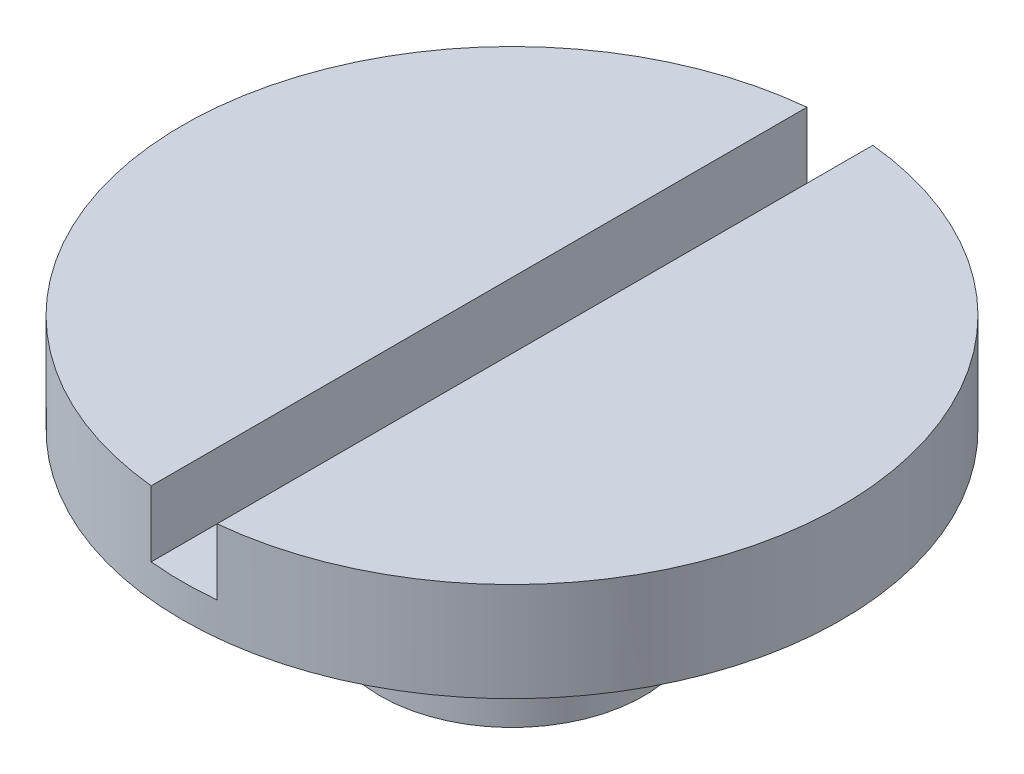
ISO-10303-21;
HEADER;
FILE_DESCRIPTION(('STEP AP214'),'2;1');
FILE_NAME('part.step','',(''),(''),'','','');
FILE_SCHEMA(('AUTOMOTIVE_DESIGN { 1 0 10303 214 1 1 1 1 }'));
ENDSEC;
DATA;
#1=APPLICATION_CONTEXT('core data for automotive mechanical design processes');
#2=APPLICATION_PROTOCOL_DEFINITION('international standard','automotive_design',2000,#1);
#3=PRODUCT_CONTEXT('',#1,'mechanical');
#4=PRODUCT('Part','Part','',(#3));
#5=PRODUCT_RELATED_PRODUCT_CATEGORY('part','',(#4));
#6=PRODUCT_DEFINITION_FORMATION('','',#4);
#7=PRODUCT_DEFINITION_CONTEXT('part definition',#1,'design');
#8=PRODUCT_DEFINITION('design','',#6,#7);
#9=PRODUCT_DEFINITION_SHAPE('','',#8);
#10=(LENGTH_UNIT() NAMED_UNIT(*) SI_UNIT(.MILLI.,.METRE.));
#11=(NAMED_UNIT(*) PLANE_ANGLE_UNIT() SI_UNIT($,.RADIAN.));
#12=(NAMED_UNIT(*) SI_UNIT($,.STERADIAN.) SOLID_ANGLE_UNIT());
#13=UNCERTAINTY_MEASURE_WITH_UNIT(LENGTH_MEASURE(1.E-05),#10,'distance_accuracy_value','');
#14=(GEOMETRIC_REPRESENTATION_CONTEXT(3) GLOBAL_UNCERTAINTY_ASSIGNED_CONTEXT((#13)) GLOBAL_UNIT_ASSIGNED_CONTEXT((#10,
#11,#12)) REPRESENTATION_CONTEXT('',''));
#15=CARTESIAN_POINT('',(0.,0.,0.));
#16=DIRECTION('',(0.,0.,1.));
#17=DIRECTION('',(1.,0.,0.));
#18=AXIS2_PLACEMENT_3D('',#15,#16,#17);
#19=CARTESIAN_POINT('',(0.,0.,0.));
#20=DIRECTION('',(0.,1.,0.));
#21=DIRECTION('',(0.,0.,1.));
#22=AXIS2_PLACEMENT_3D('',#19,#20,#21);
#23=PLANE('',#22);
#24=CARTESIAN_POINT('',(0.,0.,0.));
#25=DIRECTION('',(0.,1.,0.));
#26=DIRECTION('',(0.,0.,1.));
#27=AXIS2_PLACEMENT_3D('',#24,#25,#26);
#28=CIRCLE('',#27,50.);
#29=CARTESIAN_POINT('',(0.,0.,50.));
#30=VERTEX_POINT('',#29);
#31=EDGE_CURVE('E160',#30,#30,#28,.T.);
#32=ORIENTED_EDGE('',*,*,#31,.F.);
#33=EDGE_LOOP('',(#32));
#34=FACE_BOUND('',#33,.T.);
#35=CARTESIAN_POINT('',(0.,0.,0.));
#36=DIRECTION('',(0.,1.,0.));
#37=DIRECTION('',(0.,0.,1.));
#38=AXIS2_PLACEMENT_3D('',#35,#36,#37);
#39=CIRCLE('',#38,20.);
#40=CARTESIAN_POINT('',(0.,0.,20.));
#41=VERTEX_POINT('',#40);
#42=EDGE_CURVE('E11',#41,#41,#39,.F.);
#43=ORIENTED_EDGE('',*,*,#42,.F.);
#44=EDGE_LOOP('',(#43));
#45=FACE_BOUND('',#44,.T.);
#46=ADVANCED_FACE('F34',(#34,#45),#23,.F.);
#47=CARTESIAN_POINT('',(0.,15.,0.));
#48=DIRECTION('',(0.,1.,0.));
#49=DIRECTION('',(0.,0.,1.));
#50=AXIS2_PLACEMENT_3D('',#47,#48,#49);
#51=PLANE('',#50);
#52=DIRECTION('',(0.,0.,-1.));
#53=VECTOR('',#52,1.);
#54=CARTESIAN_POINT('',(4.99999999999999,15.,-49.749371855331));
#55=LINE('',#54,#53);
#56=CARTESIAN_POINT('',(5.,15.,49.749371855331));
#57=VERTEX_POINT('',#56);
#58=CARTESIAN_POINT('',(4.99999999999999,15.,-49.749371855331));
#59=VERTEX_POINT('',#58);
#60=EDGE_CURVE('E147',#57,#59,#55,.T.);
#61=ORIENTED_EDGE('',*,*,#60,.F.);
#62=CARTESIAN_POINT('',(0.,15.,0.));
#63=DIRECTION('',(0.,1.,0.));
#64=DIRECTION('',(0.,0.,1.));
#65=AXIS2_PLACEMENT_3D('',#62,#63,#64);
#66=CIRCLE('',#65,50.);
#67=EDGE_CURVE('E42',#57,#59,#66,.T.);
#68=ORIENTED_EDGE('',*,*,#67,.T.);
#69=EDGE_LOOP('',(#61,#68));
#70=FACE_BOUND('',#69,.T.);
#71=ADVANCED_FACE('F188',(#70),#51,.T.);
#72=CARTESIAN_POINT('',(0.,15.,0.));
#73=DIRECTION('',(0.,-1.,0.));
#74=DIRECTION('',(0.,0.,-1.));
#75=AXIS2_PLACEMENT_3D('',#72,#73,#74);
#76=CYLINDRICAL_SURFACE('',#75,50.);
#77=CARTESIAN_POINT('',(0.,5.,0.));
#78=DIRECTION('',(0.,1.,0.));
#79=DIRECTION('',(0.,0.,1.));
#80=AXIS2_PLACEMENT_3D('',#77,#78,#79);
#81=CIRCLE('',#80,50.);
#82=CARTESIAN_POINT('',(4.99999999999999,5.,-49.749371855331));
#83=VERTEX_POINT('',#82);
#84=CARTESIAN_POINT('',(-4.99999999999999,5.,-49.749371855331));
#85=VERTEX_POINT('',#84);
#86=EDGE_CURVE('E143',#83,#85,#81,.T.);
#87=ORIENTED_EDGE('',*,*,#86,.F.);
#88=DIRECTION('',(0.,1.,0.));
#89=VECTOR('',#88,1.);
#90=CARTESIAN_POINT('',(4.99999999999999,5.,-49.749371855331));
#91=LINE('',#90,#89);
#92=EDGE_CURVE('E157',#83,#59,#91,.T.);
#93=ORIENTED_EDGE('',*,*,#92,.T.);
#94=ORIENTED_EDGE('',*,*,#67,.F.);
#95=DIRECTION('',(0.,1.,0.));
#96=VECTOR('',#95,1.);
#97=CARTESIAN_POINT('',(5.,5.,49.749371855331));
#98=LINE('',#97,#96);
#99=CARTESIAN_POINT('',(5.,5.,49.749371855331));
#100=VERTEX_POINT('',#99);
#101=EDGE_CURVE('E161',#100,#57,#98,.T.);
#102=ORIENTED_EDGE('',*,*,#101,.F.);
#103=CARTESIAN_POINT('',(0.,5.,0.));
#104=DIRECTION('',(0.,1.,0.));
#105=DIRECTION('',(0.,0.,1.));
#106=AXIS2_PLACEMENT_3D('',#103,#104,#105);
#107=CIRCLE('',#106,50.);
#108=CARTESIAN_POINT('',(-4.99999999999999,5.,49.749371855331));
#109=VERTEX_POINT('',#108);
#110=EDGE_CURVE('E150',#109,#100,#107,.T.);
#111=ORIENTED_EDGE('',*,*,#110,.F.);
#112=DIRECTION('',(0.,1.,0.));
#113=VECTOR('',#112,1.);
#114=CARTESIAN_POINT('',(-4.99999999999999,5.,49.749371855331));
#115=LINE('',#114,#113);
#116=CARTESIAN_POINT('',(-4.99999999999999,15.,49.749371855331));
#117=VERTEX_POINT('',#116);
#118=EDGE_CURVE('E163',#109,#117,#115,.T.);
#119=ORIENTED_EDGE('',*,*,#118,.T.);
#120=CARTESIAN_POINT('',(-4.99999999999999,15.,-49.749371855331));
#121=VERTEX_POINT('',#120);
#122=EDGE_CURVE('E168',#121,#117,#66,.T.);
#123=ORIENTED_EDGE('',*,*,#122,.F.);
#124=DIRECTION('',(0.,1.,0.));
#125=VECTOR('',#124,1.);
#126=CARTESIAN_POINT('',(-4.99999999999999,5.,-49.749371855331));
#127=LINE('',#126,#125);
#128=EDGE_CURVE('E57',#85,#121,#127,.T.);
#129=ORIENTED_EDGE('',*,*,#128,.F.);
#130=EDGE_LOOP('',(#87,#93,#94,#102,#111,#119,#123,#129));
#131=FACE_BOUND('',#130,.T.);
#132=ORIENTED_EDGE('',*,*,#31,.T.);
#133=EDGE_LOOP('',(#132));
#134=FACE_BOUND('',#133,.T.);
#135=ADVANCED_FACE('F36',(#131,#134),#76,.T.);
#136=DIRECTION('',(0.,0.,1.));
#137=VECTOR('',#136,1.);
#138=CARTESIAN_POINT('',(-4.99999999999999,15.,-49.749371855331));
#139=LINE('',#138,#137);
#140=EDGE_CURVE('E110',#121,#117,#139,.T.);
#141=ORIENTED_EDGE('',*,*,#140,.F.);
#142=ORIENTED_EDGE('',*,*,#122,.T.);
#143=EDGE_LOOP('',(#141,#142));
#144=FACE_BOUND('',#143,.T.);
#145=ADVANCED_FACE('F175',(#144),#51,.T.);
#146=CARTESIAN_POINT('',(4.99999999999999,5.,-49.749371855331));
#147=DIRECTION('',(1.,0.,0.));
#148=DIRECTION('',(0.,0.,-1.));
#149=AXIS2_PLACEMENT_3D('',#146,#147,#148);
#150=PLANE('',#149);
#151=ORIENTED_EDGE('',*,*,#60,.T.);
#152=ORIENTED_EDGE('',*,*,#92,.F.);
#153=DIRECTION('',(0.,0.,-1.));
#154=VECTOR('',#153,1.);
#155=CARTESIAN_POINT('',(4.99999999999999,5.,-49.749371855331));
#156=LINE('',#155,#154);
#157=EDGE_CURVE('E152',#100,#83,#156,.T.);
#158=ORIENTED_EDGE('',*,*,#157,.F.);
#159=ORIENTED_EDGE('',*,*,#101,.T.);
#160=EDGE_LOOP('',(#151,#152,#158,#159));
#161=FACE_BOUND('',#160,.T.);
#162=ADVANCED_FACE('F189',(#161),#150,.F.);
#163=CARTESIAN_POINT('',(-4.99999999999999,5.,-49.749371855331));
#164=DIRECTION('',(-1.,0.,0.));
#165=DIRECTION('',(0.,0.,1.));
#166=AXIS2_PLACEMENT_3D('',#163,#164,#165);
#167=PLANE('',#166);
#168=ORIENTED_EDGE('',*,*,#140,.T.);
#169=ORIENTED_EDGE('',*,*,#118,.F.);
#170=DIRECTION('',(0.,0.,1.));
#171=VECTOR('',#170,1.);
#172=CARTESIAN_POINT('',(-4.99999999999999,5.,-49.749371855331));
#173=LINE('',#172,#171);
#174=EDGE_CURVE('E146',#85,#109,#173,.T.);
#175=ORIENTED_EDGE('',*,*,#174,.F.);
#176=ORIENTED_EDGE('',*,*,#128,.T.);
#177=EDGE_LOOP('',(#168,#169,#175,#176));
#178=FACE_BOUND('',#177,.T.);
#179=ADVANCED_FACE('F180',(#178),#167,.F.);
#180=CARTESIAN_POINT('',(0.,5.,0.));
#181=DIRECTION('',(0.,1.,0.));
#182=DIRECTION('',(0.,0.,1.));
#183=AXIS2_PLACEMENT_3D('',#180,#181,#182);
#184=PLANE('',#183);
#185=ORIENTED_EDGE('',*,*,#86,.T.);
#186=ORIENTED_EDGE('',*,*,#174,.T.);
#187=ORIENTED_EDGE('',*,*,#110,.T.);
#188=ORIENTED_EDGE('',*,*,#157,.T.);
#189=EDGE_LOOP('',(#185,#186,#187,#188));
#190=FACE_BOUND('',#189,.T.);
#191=ADVANCED_FACE('F182',(#190),#184,.T.);
#192=CARTESIAN_POINT('',(0.,-25.,0.));
#193=DIRECTION('',(0.,1.,0.));
#194=DIRECTION('',(0.,0.,1.));
#195=AXIS2_PLACEMENT_3D('',#192,#193,#194);
#196=CYLINDRICAL_SURFACE('',#195,15.);
#197=CARTESIAN_POINT('',(0.,0.,0.));
#198=DIRECTION('',(0.,-1.,0.));
#199=DIRECTION('',(0.,0.,-1.));
#200=AXIS2_PLACEMENT_3D('',#197,#198,#199);
#201=CIRCLE('',#200,15.);
#202=CARTESIAN_POINT('',(-3.,0.,14.6969384566991));
#203=VERTEX_POINT('',#202);
#204=CARTESIAN_POINT('',(3.,0.,14.6969384566991));
#205=VERTEX_POINT('',#204);
#206=EDGE_CURVE('E106',#203,#205,#201,.T.);
#207=ORIENTED_EDGE('',*,*,#206,.F.);
#208=DIRECTION('',(0.,1.,0.));
#209=VECTOR('',#208,1.);
#210=CARTESIAN_POINT('',(-3.,-25.,14.6969384566991));
#211=LINE('',#210,#209);
#212=CARTESIAN_POINT('',(-3.,-25.,14.6969384566991));
#213=VERTEX_POINT('',#212);
#214=EDGE_CURVE('E99',#213,#203,#211,.T.);
#215=ORIENTED_EDGE('',*,*,#214,.F.);
#216=CARTESIAN_POINT('',(0.,-25.,0.));
#217=DIRECTION('',(0.,-1.,0.));
#218=DIRECTION('',(0.,0.,-1.));
#219=AXIS2_PLACEMENT_3D('',#216,#217,#218);
#220=CIRCLE('',#219,15.);
#221=CARTESIAN_POINT('',(3.,-25.,14.6969384566991));
#222=VERTEX_POINT('',#221);
#223=EDGE_CURVE('E103',#213,#222,#220,.T.);
#224=ORIENTED_EDGE('',*,*,#223,.T.);
#225=DIRECTION('',(0.,1.,0.));
#226=VECTOR('',#225,1.);
#227=CARTESIAN_POINT('',(3.,-25.,14.6969384566991));
#228=LINE('',#227,#226);
#229=EDGE_CURVE('E132',#222,#205,#228,.T.);
#230=ORIENTED_EDGE('',*,*,#229,.T.);
#231=EDGE_LOOP('',(#207,#215,#224,#230));
#232=FACE_BOUND('',#231,.T.);
#233=ADVANCED_FACE('F101',(#232),#196,.F.);
#234=CARTESIAN_POINT('',(-3.,-25.,0.));
#235=DIRECTION('',(-1.,0.,0.));
#236=DIRECTION('',(0.,0.,1.));
#237=AXIS2_PLACEMENT_3D('',#234,#235,#236);
#238=PLANE('',#237);
#239=DIRECTION('',(0.,0.,1.));
#240=VECTOR('',#239,1.);
#241=CARTESIAN_POINT('',(-3.,0.,0.));
#242=LINE('',#241,#240);
#243=CARTESIAN_POINT('',(-3.,0.,18.6969384566991));
#244=VERTEX_POINT('',#243);
#245=EDGE_CURVE('E134',#203,#244,#242,.T.);
#246=ORIENTED_EDGE('',*,*,#245,.T.);
#247=DIRECTION('',(0.,1.,0.));
#248=VECTOR('',#247,1.);
#249=CARTESIAN_POINT('',(-3.,-25.,18.6969384566991));
#250=LINE('',#249,#248);
#251=CARTESIAN_POINT('',(-3.,-25.,18.6969384566991));
#252=VERTEX_POINT('',#251);
#253=EDGE_CURVE('E111',#252,#244,#250,.T.);
#254=ORIENTED_EDGE('',*,*,#253,.F.);
#255=DIRECTION('',(0.,0.,1.));
#256=VECTOR('',#255,1.);
#257=CARTESIAN_POINT('',(-3.,-25.,0.));
#258=LINE('',#257,#256);
#259=EDGE_CURVE('E114',#213,#252,#258,.T.);
#260=ORIENTED_EDGE('',*,*,#259,.F.);
#261=ORIENTED_EDGE('',*,*,#214,.T.);
#262=EDGE_LOOP('',(#246,#254,#260,#261));
#263=FACE_BOUND('',#262,.T.);
#264=ADVANCED_FACE('F115',(#263),#238,.F.);
#265=CARTESIAN_POINT('',(0.,-25.,18.6969384566991));
#266=DIRECTION('',(0.,0.,-1.));
#267=DIRECTION('',(-1.,0.,0.));
#268=AXIS2_PLACEMENT_3D('',#265,#266,#267);
#269=PLANE('',#268);
#270=DIRECTION('',(-1.,0.,0.));
#271=VECTOR('',#270,1.);
#272=CARTESIAN_POINT('',(0.,0.,18.6969384566991));
#273=LINE('',#272,#271);
#274=CARTESIAN_POINT('',(3.,0.,18.6969384566991));
#275=VERTEX_POINT('',#274);
#276=EDGE_CURVE('E49',#275,#244,#273,.T.);
#277=ORIENTED_EDGE('',*,*,#276,.F.);
#278=DIRECTION('',(0.,1.,0.));
#279=VECTOR('',#278,1.);
#280=CARTESIAN_POINT('',(3.,-25.,18.6969384566991));
#281=LINE('',#280,#279);
#282=CARTESIAN_POINT('',(3.,-25.,18.6969384566991));
#283=VERTEX_POINT('',#282);
#284=EDGE_CURVE('E140',#283,#275,#281,.T.);
#285=ORIENTED_EDGE('',*,*,#284,.F.);
#286=DIRECTION('',(-1.,0.,0.));
#287=VECTOR('',#286,1.);
#288=CARTESIAN_POINT('',(0.,-25.,18.6969384566991));
#289=LINE('',#288,#287);
#290=EDGE_CURVE('E119',#283,#252,#289,.T.);
#291=ORIENTED_EDGE('',*,*,#290,.T.);
#292=ORIENTED_EDGE('',*,*,#253,.T.);
#293=EDGE_LOOP('',(#277,#285,#291,#292));
#294=FACE_BOUND('',#293,.T.);
#295=ADVANCED_FACE('F216',(#294),#269,.T.);
#296=CARTESIAN_POINT('',(0.,-25.,0.));
#297=DIRECTION('',(0.,1.,0.));
#298=DIRECTION('',(0.,0.,1.));
#299=AXIS2_PLACEMENT_3D('',#296,#297,#298);
#300=CYLINDRICAL_SURFACE('',#299,20.);
#301=CARTESIAN_POINT('',(0.,-25.,0.));
#302=DIRECTION('',(0.,-1.,0.));
#303=DIRECTION('',(0.,0.,-1.));
#304=AXIS2_PLACEMENT_3D('',#301,#302,#303);
#305=CIRCLE('',#304,20.);
#306=CARTESIAN_POINT('',(0.,-25.,-20.));
#307=VERTEX_POINT('',#306);
#308=EDGE_CURVE('E124',#307,#307,#305,.T.);
#309=ORIENTED_EDGE('',*,*,#308,.F.);
#310=EDGE_LOOP('',(#309));
#311=FACE_BOUND('',#310,.T.);
#312=ORIENTED_EDGE('',*,*,#42,.T.);
#313=EDGE_LOOP('',(#312));
#314=FACE_BOUND('',#313,.T.);
#315=ADVANCED_FACE('F218',(#311,#314),#300,.T.);
#316=CARTESIAN_POINT('',(3.,-25.,0.));
#317=DIRECTION('',(-1.,0.,0.));
#318=DIRECTION('',(0.,0.,1.));
#319=AXIS2_PLACEMENT_3D('',#316,#317,#318);
#320=PLANE('',#319);
#321=DIRECTION('',(0.,0.,1.));
#322=VECTOR('',#321,1.);
#323=CARTESIAN_POINT('',(3.,0.,0.));
#324=LINE('',#323,#322);
#325=EDGE_CURVE('E127',#205,#275,#324,.T.);
#326=ORIENTED_EDGE('',*,*,#325,.F.);
#327=ORIENTED_EDGE('',*,*,#229,.F.);
#328=DIRECTION('',(0.,0.,1.));
#329=VECTOR('',#328,1.);
#330=CARTESIAN_POINT('',(3.,-25.,0.));
#331=LINE('',#330,#329);
#332=EDGE_CURVE('E123',#222,#283,#331,.T.);
#333=ORIENTED_EDGE('',*,*,#332,.T.);
#334=ORIENTED_EDGE('',*,*,#284,.T.);
#335=EDGE_LOOP('',(#326,#327,#333,#334));
#336=FACE_BOUND('',#335,.T.);
#337=ADVANCED_FACE('F211',(#336),#320,.T.);
#338=CARTESIAN_POINT('',(0.,-25.,0.));
#339=DIRECTION('',(0.,-1.,0.));
#340=DIRECTION('',(0.,0.,-1.));
#341=AXIS2_PLACEMENT_3D('',#338,#339,#340);
#342=PLANE('',#341);
#343=ORIENTED_EDGE('',*,*,#308,.T.);
#344=EDGE_LOOP('',(#343));
#345=FACE_BOUND('',#344,.T.);
#346=ORIENTED_EDGE('',*,*,#223,.F.);
#347=ORIENTED_EDGE('',*,*,#259,.T.);
#348=ORIENTED_EDGE('',*,*,#290,.F.);
#349=ORIENTED_EDGE('',*,*,#332,.F.);
#350=EDGE_LOOP('',(#346,#347,#348,#349));
#351=FACE_BOUND('',#350,.T.);
#352=ADVANCED_FACE('F121',(#345,#351),#342,.T.);
#353=ORIENTED_EDGE('',*,*,#245,.F.);
#354=ORIENTED_EDGE('',*,*,#206,.T.);
#355=ORIENTED_EDGE('',*,*,#325,.T.);
#356=ORIENTED_EDGE('',*,*,#276,.T.);
#357=EDGE_LOOP('',(#353,#354,#355,#356));
#358=FACE_BOUND('',#357,.T.);
#359=ADVANCED_FACE('F201',(#358),#23,.F.);
#360=CLOSED_SHELL('',(#46,#71,#135,#145,#162,#179,#191,#233,#264,#295,#315,#337,#352,#359));
#361=MANIFOLD_SOLID_BREP('B2',#360);
#362=ADVANCED_BREP_SHAPE_REPRESENTATION('',(#18,#361),#14);
#363=SHAPE_DEFINITION_REPRESENTATION(#9,#362);
ENDSEC;
END-ISO-10303-21;
